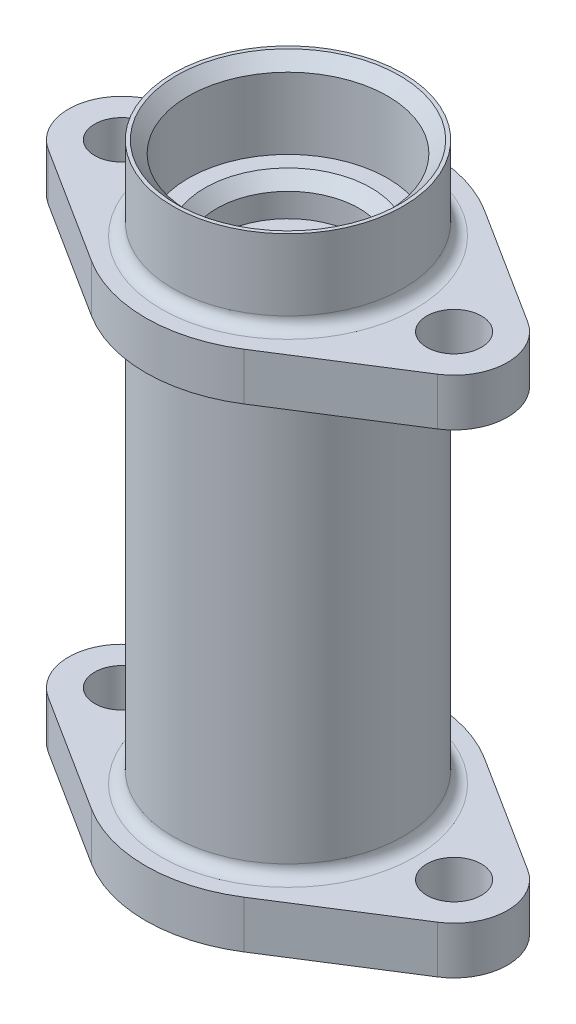
ISO-10303-21;
HEADER;
FILE_DESCRIPTION(('STEP AP214'),'2;1');
FILE_NAME('part.step','',(''),(''),'','','');
FILE_SCHEMA(('AUTOMOTIVE_DESIGN { 1 0 10303 214 1 1 1 1 }'));
ENDSEC;
DATA;
#1=APPLICATION_CONTEXT('core data for automotive mechanical design processes');
#2=APPLICATION_PROTOCOL_DEFINITION('international standard','automotive_design',2000,#1);
#3=PRODUCT_CONTEXT('',#1,'mechanical');
#4=PRODUCT('Part','Part','',(#3));
#5=PRODUCT_RELATED_PRODUCT_CATEGORY('part','',(#4));
#6=PRODUCT_DEFINITION_FORMATION('','',#4);
#7=PRODUCT_DEFINITION_CONTEXT('part definition',#1,'design');
#8=PRODUCT_DEFINITION('design','',#6,#7);
#9=PRODUCT_DEFINITION_SHAPE('','',#8);
#10=(LENGTH_UNIT() NAMED_UNIT(*) SI_UNIT(.MILLI.,.METRE.));
#11=(NAMED_UNIT(*) PLANE_ANGLE_UNIT() SI_UNIT($,.RADIAN.));
#12=(NAMED_UNIT(*) SI_UNIT($,.STERADIAN.) SOLID_ANGLE_UNIT());
#13=UNCERTAINTY_MEASURE_WITH_UNIT(LENGTH_MEASURE(1.E-05),#10,'distance_accuracy_value','');
#14=(GEOMETRIC_REPRESENTATION_CONTEXT(3) GLOBAL_UNCERTAINTY_ASSIGNED_CONTEXT((#13)) GLOBAL_UNIT_ASSIGNED_CONTEXT((#10,
#11,#12)) REPRESENTATION_CONTEXT('',''));
#15=CARTESIAN_POINT('',(0.,0.,0.));
#16=DIRECTION('',(0.,0.,1.));
#17=DIRECTION('',(1.,0.,0.));
#18=AXIS2_PLACEMENT_3D('',#15,#16,#17);
#19=CARTESIAN_POINT('',(0.,22.0000000000482,0.));
#20=DIRECTION('',(0.,1.,0.));
#21=DIRECTION('',(0.,0.,1.));
#22=AXIS2_PLACEMENT_3D('',#19,#20,#21);
#23=CONICAL_SURFACE('',#22,3.49999999997408,0.785398163454292);
#24=CARTESIAN_POINT('',(0.,22.0000000000482,0.));
#25=DIRECTION('',(0.,1.,0.));
#26=DIRECTION('',(0.,0.,1.));
#27=AXIS2_PLACEMENT_3D('',#24,#25,#26);
#28=CIRCLE('',#27,3.49999999997408);
#29=CARTESIAN_POINT('',(0.,22.0000000000482,3.49999999997408));
#30=VERTEX_POINT('',#29);
#31=EDGE_CURVE('E211',#30,#30,#28,.F.);
#32=ORIENTED_EDGE('',*,*,#31,.F.);
#33=EDGE_LOOP('',(#32));
#34=FACE_BOUND('',#33,.T.);
#35=CARTESIAN_POINT('',(0.,21.5,0.));
#36=DIRECTION('',(0.,1.,0.));
#37=DIRECTION('',(0.,0.,1.));
#38=AXIS2_PLACEMENT_3D('',#35,#36,#37);
#39=CIRCLE('',#38,3.00000000000002);
#40=CARTESIAN_POINT('',(0.,21.5,3.00000000000002));
#41=VERTEX_POINT('',#40);
#42=EDGE_CURVE('E210',#41,#41,#39,.F.);
#43=ORIENTED_EDGE('',*,*,#42,.T.);
#44=EDGE_LOOP('',(#43));
#45=FACE_BOUND('',#44,.T.);
#46=ADVANCED_FACE('F17',(#34,#45),#23,.F.);
#47=CARTESIAN_POINT('',(0.,22.,0.));
#48=DIRECTION('',(0.,1.,0.));
#49=DIRECTION('',(0.,0.,1.));
#50=AXIS2_PLACEMENT_3D('',#47,#48,#49);
#51=PLANE('',#50);
#52=CARTESIAN_POINT('',(0.,22.,0.));
#53=DIRECTION('',(0.,1.,0.));
#54=DIRECTION('',(0.,0.,1.));
#55=AXIS2_PLACEMENT_3D('',#52,#53,#54);
#56=CIRCLE('',#55,4.20000000000003);
#57=CARTESIAN_POINT('',(0.,22.,4.20000000000003));
#58=VERTEX_POINT('',#57);
#59=EDGE_CURVE('E207',#58,#58,#56,.T.);
#60=ORIENTED_EDGE('',*,*,#59,.T.);
#61=EDGE_LOOP('',(#60));
#62=FACE_BOUND('',#61,.T.);
#63=ORIENTED_EDGE('',*,*,#31,.T.);
#64=EDGE_LOOP('',(#63));
#65=FACE_BOUND('',#64,.T.);
#66=ADVANCED_FACE('F877',(#62,#65),#51,.T.);
#67=CARTESIAN_POINT('',(0.,20.5,0.));
#68=DIRECTION('',(0.,1.,0.));
#69=DIRECTION('',(0.,0.,1.));
#70=AXIS2_PLACEMENT_3D('',#67,#68,#69);
#71=CYLINDRICAL_SURFACE('',#70,3.00000000000002);
#72=ORIENTED_EDGE('',*,*,#42,.F.);
#73=EDGE_LOOP('',(#72));
#74=FACE_BOUND('',#73,.T.);
#75=CARTESIAN_POINT('',(0.,20.5,0.));
#76=DIRECTION('',(0.,1.,0.));
#77=DIRECTION('',(0.,0.,1.));
#78=AXIS2_PLACEMENT_3D('',#75,#76,#77);
#79=CIRCLE('',#78,3.00000000000002);
#80=CARTESIAN_POINT('',(0.,20.5,3.00000000000002));
#81=VERTEX_POINT('',#80);
#82=EDGE_CURVE('E204',#81,#81,#79,.T.);
#83=ORIENTED_EDGE('',*,*,#82,.F.);
#84=EDGE_LOOP('',(#83));
#85=FACE_BOUND('',#84,.T.);
#86=ADVANCED_FACE('F868',(#74,#85),#71,.F.);
#87=CARTESIAN_POINT('',(0.,22.,0.));
#88=DIRECTION('',(0.,1.,0.));
#89=DIRECTION('',(0.,0.,1.));
#90=AXIS2_PLACEMENT_3D('',#87,#88,#89);
#91=CYLINDRICAL_SURFACE('',#90,4.20000000000003);
#92=ORIENTED_EDGE('',*,*,#59,.F.);
#93=EDGE_LOOP('',(#92));
#94=FACE_BOUND('',#93,.T.);
#95=CARTESIAN_POINT('',(0.,24.9999999999773,0.));
#96=DIRECTION('',(0.,1.,0.));
#97=DIRECTION('',(0.,0.,1.));
#98=AXIS2_PLACEMENT_3D('',#95,#96,#97);
#99=CIRCLE('',#98,4.20000000002574);
#100=CARTESIAN_POINT('',(0.,24.9999999999773,4.20000000002574));
#101=VERTEX_POINT('',#100);
#102=EDGE_CURVE('E203',#101,#101,#99,.T.);
#103=ORIENTED_EDGE('',*,*,#102,.T.);
#104=EDGE_LOOP('',(#103));
#105=FACE_BOUND('',#104,.T.);
#106=ADVANCED_FACE('F859',(#94,#105),#91,.F.);
#107=CARTESIAN_POINT('',(0.,20.5,0.));
#108=DIRECTION('',(0.,1.,0.));
#109=DIRECTION('',(0.,0.,1.));
#110=AXIS2_PLACEMENT_3D('',#107,#108,#109);
#111=PLANE('',#110);
#112=ORIENTED_EDGE('',*,*,#82,.T.);
#113=EDGE_LOOP('',(#112));
#114=FACE_BOUND('',#113,.T.);
#115=CARTESIAN_POINT('',(0.,20.5,0.));
#116=DIRECTION('',(0.,1.,0.));
#117=DIRECTION('',(0.,0.,1.));
#118=AXIS2_PLACEMENT_3D('',#115,#116,#117);
#119=CIRCLE('',#118,1.00000000000001);
#120=CARTESIAN_POINT('',(0.,20.5,1.00000000000001));
#121=VERTEX_POINT('',#120);
#122=EDGE_CURVE('E200',#121,#121,#119,.F.);
#123=ORIENTED_EDGE('',*,*,#122,.T.);
#124=EDGE_LOOP('',(#123));
#125=FACE_BOUND('',#124,.T.);
#126=ADVANCED_FACE('F850',(#114,#125),#111,.T.);
#127=CARTESIAN_POINT('',(0.,25.4999999999654,0.));
#128=DIRECTION('',(0.,1.,0.));
#129=DIRECTION('',(-1.,0.,0.));
#130=AXIS2_PLACEMENT_3D('',#127,#128,#129);
#131=CONICAL_SURFACE('',#130,4.70000000001392,0.785398163397448);
#132=ORIENTED_EDGE('',*,*,#102,.F.);
#133=EDGE_LOOP('',(#132));
#134=FACE_BOUND('',#133,.T.);
#135=CARTESIAN_POINT('',(0.,25.4999999999654,0.));
#136=DIRECTION('',(0.,1.,0.));
#137=DIRECTION('',(-1.,0.,0.));
#138=AXIS2_PLACEMENT_3D('',#135,#136,#137);
#139=CIRCLE('',#138,4.70000000001392);
#140=CARTESIAN_POINT('',(-4.70000000001392,25.4999999999654,0.));
#141=VERTEX_POINT('',#140);
#142=EDGE_CURVE('E197',#141,#141,#139,.F.);
#143=ORIENTED_EDGE('',*,*,#142,.F.);
#144=EDGE_LOOP('',(#143));
#145=FACE_BOUND('',#144,.T.);
#146=ADVANCED_FACE('F841',(#134,#145),#131,.F.);
#147=CARTESIAN_POINT('',(0.,0.,0.));
#148=DIRECTION('',(0.,1.,0.));
#149=DIRECTION('',(0.,0.,1.));
#150=AXIS2_PLACEMENT_3D('',#147,#148,#149);
#151=CYLINDRICAL_SURFACE('',#150,1.00000000000001);
#152=ORIENTED_EDGE('',*,*,#122,.F.);
#153=EDGE_LOOP('',(#152));
#154=FACE_BOUND('',#153,.T.);
#155=CARTESIAN_POINT('',(0.,19.,0.));
#156=DIRECTION('',(0.,1.,0.));
#157=DIRECTION('',(0.,0.,1.));
#158=AXIS2_PLACEMENT_3D('',#155,#156,#157);
#159=CIRCLE('',#158,1.00000000000001);
#160=CARTESIAN_POINT('',(0.,19.,1.00000000000001));
#161=VERTEX_POINT('',#160);
#162=EDGE_CURVE('E194',#161,#161,#159,.T.);
#163=ORIENTED_EDGE('',*,*,#162,.F.);
#164=EDGE_LOOP('',(#163));
#165=FACE_BOUND('',#164,.T.);
#166=ADVANCED_FACE('F832',(#154,#165),#151,.F.);
#167=CARTESIAN_POINT('',(0.,25.5,0.));
#168=DIRECTION('',(0.,1.,0.));
#169=DIRECTION('',(0.,0.,1.));
#170=AXIS2_PLACEMENT_3D('',#167,#168,#169);
#171=PLANE('',#170);
#172=CARTESIAN_POINT('',(0.,25.5,0.));
#173=DIRECTION('',(0.,-1.,0.));
#174=DIRECTION('',(0.,0.,-1.));
#175=AXIS2_PLACEMENT_3D('',#172,#173,#174);
#176=CIRCLE('',#175,4.85000000000003);
#177=CARTESIAN_POINT('',(0.,25.5,-4.85000000000003));
#178=VERTEX_POINT('',#177);
#179=EDGE_CURVE('E191',#178,#178,#176,.T.);
#180=ORIENTED_EDGE('',*,*,#179,.F.);
#181=EDGE_LOOP('',(#180));
#182=FACE_BOUND('',#181,.T.);
#183=ORIENTED_EDGE('',*,*,#142,.T.);
#184=EDGE_LOOP('',(#183));
#185=FACE_BOUND('',#184,.T.);
#186=ADVANCED_FACE('F823',(#182,#185),#171,.T.);
#187=CARTESIAN_POINT('',(0.,19.,0.));
#188=DIRECTION('',(0.,-1.,0.));
#189=DIRECTION('',(0.,0.,-1.));
#190=AXIS2_PLACEMENT_3D('',#187,#188,#189);
#191=PLANE('',#190);
#192=ORIENTED_EDGE('',*,*,#162,.T.);
#193=EDGE_LOOP('',(#192));
#194=FACE_BOUND('',#193,.T.);
#195=CARTESIAN_POINT('',(0.,19.,0.));
#196=DIRECTION('',(0.,-1.,0.));
#197=DIRECTION('',(0.,0.,-1.));
#198=AXIS2_PLACEMENT_3D('',#195,#196,#197);
#199=CIRCLE('',#198,4.20000000000003);
#200=CARTESIAN_POINT('',(0.,19.,-4.20000000000003));
#201=VERTEX_POINT('',#200);
#202=EDGE_CURVE('E187',#201,#201,#199,.T.);
#203=ORIENTED_EDGE('',*,*,#202,.T.);
#204=EDGE_LOOP('',(#203));
#205=FACE_BOUND('',#204,.T.);
#206=ADVANCED_FACE('F814',(#194,#205),#191,.T.);
#207=CARTESIAN_POINT('',(0.,25.5,0.));
#208=DIRECTION('',(0.,-1.,0.));
#209=DIRECTION('',(0.,0.,-1.));
#210=AXIS2_PLACEMENT_3D('',#207,#208,#209);
#211=CYLINDRICAL_SURFACE('',#210,4.85000000000003);
#212=CARTESIAN_POINT('',(0.,22.5,0.));
#213=DIRECTION('',(0.,1.,0.));
#214=DIRECTION('',(0.,0.,1.));
#215=AXIS2_PLACEMENT_3D('',#212,#213,#214);
#216=CIRCLE('',#215,4.85);
#217=CARTESIAN_POINT('',(0.,22.5,4.85));
#218=VERTEX_POINT('',#217);
#219=EDGE_CURVE('E190',#218,#218,#216,.T.);
#220=ORIENTED_EDGE('',*,*,#219,.T.);
#221=EDGE_LOOP('',(#220));
#222=FACE_BOUND('',#221,.T.);
#223=ORIENTED_EDGE('',*,*,#179,.T.);
#224=EDGE_LOOP('',(#223));
#225=FACE_BOUND('',#224,.T.);
#226=ADVANCED_FACE('F806',(#222,#225),#211,.T.);
#227=CARTESIAN_POINT('',(0.,19.,0.));
#228=DIRECTION('',(0.,-1.,0.));
#229=DIRECTION('',(0.,0.,-1.));
#230=AXIS2_PLACEMENT_3D('',#227,#228,#229);
#231=CYLINDRICAL_SURFACE('',#230,4.20000000000003);
#232=ORIENTED_EDGE('',*,*,#202,.F.);
#233=EDGE_LOOP('',(#232));
#234=FACE_BOUND('',#233,.T.);
#235=CARTESIAN_POINT('',(0.,0.5,0.));
#236=DIRECTION('',(0.,1.,0.));
#237=DIRECTION('',(0.,0.,1.));
#238=AXIS2_PLACEMENT_3D('',#235,#236,#237);
#239=CIRCLE('',#238,4.2);
#240=CARTESIAN_POINT('',(0.,0.5,4.2));
#241=VERTEX_POINT('',#240);
#242=EDGE_CURVE('E492',#241,#241,#239,.T.);
#243=ORIENTED_EDGE('',*,*,#242,.F.);
#244=EDGE_LOOP('',(#243));
#245=FACE_BOUND('',#244,.T.);
#246=ADVANCED_FACE('F798',(#234,#245),#231,.F.);
#247=CARTESIAN_POINT('',(0.,22.5,0.));
#248=DIRECTION('',(0.,1.,0.));
#249=DIRECTION('',(0.,0.,1.));
#250=AXIS2_PLACEMENT_3D('',#247,#248,#249);
#251=TOROIDAL_SURFACE('',#250,5.35,0.5);
#252=ORIENTED_EDGE('',*,*,#219,.F.);
#253=EDGE_LOOP('',(#252));
#254=FACE_BOUND('',#253,.T.);
#255=CARTESIAN_POINT('',(0.,22.,0.));
#256=DIRECTION('',(0.,1.,0.));
#257=DIRECTION('',(0.,0.,-1.));
#258=AXIS2_PLACEMENT_3D('',#255,#256,#257);
#259=CIRCLE('',#258,5.35000000000002);
#260=CARTESIAN_POINT('',(0.,22.,5.35000000000002));
#261=VERTEX_POINT('',#260);
#262=CARTESIAN_POINT('',(0.,22.,-5.35000000000002));
#263=VERTEX_POINT('',#262);
#264=EDGE_CURVE('E445',#261,#263,#259,.F.);
#265=ORIENTED_EDGE('',*,*,#264,.F.);
#266=CARTESIAN_POINT('',(0.,22.,0.));
#267=DIRECTION('',(0.,1.,0.));
#268=DIRECTION('',(0.,0.,1.));
#269=AXIS2_PLACEMENT_3D('',#266,#267,#268);
#270=CIRCLE('',#269,5.35000000000002);
#271=EDGE_CURVE('E455',#263,#261,#270,.F.);
#272=ORIENTED_EDGE('',*,*,#271,.F.);
#273=EDGE_LOOP('',(#265,#272));
#274=FACE_BOUND('',#273,.T.);
#275=ADVANCED_FACE('F473',(#254,#274),#251,.F.);
#276=CARTESIAN_POINT('',(0.,0.5,0.));
#277=DIRECTION('',(0.,1.,0.));
#278=DIRECTION('',(0.,0.,1.));
#279=AXIS2_PLACEMENT_3D('',#276,#277,#278);
#280=TOROIDAL_SURFACE('',#279,4.7,0.5);
#281=CARTESIAN_POINT('',(0.,0.,0.));
#282=DIRECTION('',(0.,-1.,0.));
#283=DIRECTION('',(0.,0.,1.));
#284=AXIS2_PLACEMENT_3D('',#281,#282,#283);
#285=CIRCLE('',#284,4.70000000000002);
#286=CARTESIAN_POINT('',(0.,0.,4.70000000000002));
#287=VERTEX_POINT('',#286);
#288=CARTESIAN_POINT('',(0.,0.,-4.70000000000002));
#289=VERTEX_POINT('',#288);
#290=EDGE_CURVE('E402',#287,#289,#285,.T.);
#291=ORIENTED_EDGE('',*,*,#290,.T.);
#292=CARTESIAN_POINT('',(0.,0.,0.));
#293=DIRECTION('',(0.,-1.,0.));
#294=DIRECTION('',(0.,0.,-1.));
#295=AXIS2_PLACEMENT_3D('',#292,#293,#294);
#296=CIRCLE('',#295,4.70000000000002);
#297=EDGE_CURVE('E186',#289,#287,#296,.T.);
#298=ORIENTED_EDGE('',*,*,#297,.T.);
#299=EDGE_LOOP('',(#291,#298));
#300=FACE_BOUND('',#299,.T.);
#301=ORIENTED_EDGE('',*,*,#242,.T.);
#302=EDGE_LOOP('',(#301));
#303=FACE_BOUND('',#302,.T.);
#304=ADVANCED_FACE('F470',(#300,#303),#280,.T.);
#305=CARTESIAN_POINT('',(0.,22.,0.));
#306=DIRECTION('',(0.,1.,0.));
#307=DIRECTION('',(0.,0.,1.));
#308=AXIS2_PLACEMENT_3D('',#305,#306,#307);
#309=PLANE('',#308);
#310=CARTESIAN_POINT('',(7.00000000000001,22.,0.));
#311=DIRECTION('',(0.,-1.,0.));
#312=DIRECTION('',(0.,0.,-1.));
#313=AXIS2_PLACEMENT_3D('',#310,#311,#312);
#314=CIRCLE('',#313,1.15000000000001);
#315=CARTESIAN_POINT('',(7.00000000000001,22.,-1.15000000000001));
#316=VERTEX_POINT('',#315);
#317=EDGE_CURVE('E378',#316,#316,#314,.T.);
#318=ORIENTED_EDGE('',*,*,#317,.T.);
#319=EDGE_LOOP('',(#318));
#320=FACE_BOUND('',#319,.T.);
#321=CARTESIAN_POINT('',(-7.00000000000006,22.,0.));
#322=DIRECTION('',(0.,-1.,0.));
#323=DIRECTION('',(0.,0.,-1.));
#324=AXIS2_PLACEMENT_3D('',#321,#322,#323);
#325=CIRCLE('',#324,2.25000000000002);
#326=CARTESIAN_POINT('',(-8.20535714285719,22.,1.89989845996129));
#327=VERTEX_POINT('',#326);
#328=CARTESIAN_POINT('',(-8.20535714285718,22.,-1.89989845996129));
#329=VERTEX_POINT('',#328);
#330=EDGE_CURVE('E388',#327,#329,#325,.T.);
#331=ORIENTED_EDGE('',*,*,#330,.F.);
#332=DIRECTION('',(-0.844399315538349,0.,-0.535714285714286));
#333=VECTOR('',#332,1.);
#334=CARTESIAN_POINT('',(-8.20535714285717,22.,1.8998984599613));
#335=LINE('',#334,#333);
#336=CARTESIAN_POINT('',(-3.21428571428573,22.,5.06639589323013));
#337=VERTEX_POINT('',#336);
#338=EDGE_CURVE('E381',#327,#337,#335,.F.);
#339=ORIENTED_EDGE('',*,*,#338,.T.);
#340=CARTESIAN_POINT('',(0.,22.,0.));
#341=DIRECTION('',(0.,-1.,0.));
#342=DIRECTION('',(0.,0.,-1.));
#343=AXIS2_PLACEMENT_3D('',#340,#341,#342);
#344=CIRCLE('',#343,6.00000000000004);
#345=CARTESIAN_POINT('',(3.21428571428573,22.,5.06639589323012));
#346=VERTEX_POINT('',#345);
#347=EDGE_CURVE('E162',#346,#337,#344,.T.);
#348=ORIENTED_EDGE('',*,*,#347,.F.);
#349=DIRECTION('',(-0.844399315538349,0.,0.535714285714286));
#350=VECTOR('',#349,1.);
#351=CARTESIAN_POINT('',(3.21428571428573,22.,5.0663958932301));
#352=LINE('',#351,#350);
#353=CARTESIAN_POINT('',(8.20535714285715,22.,1.8998984599613));
#354=VERTEX_POINT('',#353);
#355=EDGE_CURVE('E157',#346,#354,#352,.F.);
#356=ORIENTED_EDGE('',*,*,#355,.T.);
#357=CARTESIAN_POINT('',(7.00000000000001,22.,0.));
#358=DIRECTION('',(0.,-1.,0.));
#359=DIRECTION('',(0.,0.,-1.));
#360=AXIS2_PLACEMENT_3D('',#357,#358,#359);
#361=CIRCLE('',#360,2.25000000000002);
#362=CARTESIAN_POINT('',(8.20535714285717,22.,-1.89989845996133));
#363=VERTEX_POINT('',#362);
#364=EDGE_CURVE('E154',#363,#354,#361,.T.);
#365=ORIENTED_EDGE('',*,*,#364,.F.);
#366=DIRECTION('',(0.844399315538349,0.,0.535714285714286));
#367=VECTOR('',#366,1.);
#368=CARTESIAN_POINT('',(8.20535714285716,22.,-1.89989845996133));
#369=LINE('',#368,#367);
#370=CARTESIAN_POINT('',(3.21428571428573,22.,-5.06639589323014));
#371=VERTEX_POINT('',#370);
#372=EDGE_CURVE('E396',#363,#371,#369,.F.);
#373=ORIENTED_EDGE('',*,*,#372,.T.);
#374=CARTESIAN_POINT('',(0.,22.,0.));
#375=DIRECTION('',(0.,-1.,0.));
#376=DIRECTION('',(0.,0.,-1.));
#377=AXIS2_PLACEMENT_3D('',#374,#375,#376);
#378=CIRCLE('',#377,6.00000000000004);
#379=CARTESIAN_POINT('',(-3.21428571428572,22.,-5.0663958932301));
#380=VERTEX_POINT('',#379);
#381=EDGE_CURVE('E182',#380,#371,#378,.T.);
#382=ORIENTED_EDGE('',*,*,#381,.F.);
#383=DIRECTION('',(0.844399315538349,0.,-0.535714285714286));
#384=VECTOR('',#383,1.);
#385=CARTESIAN_POINT('',(-3.21428571428573,22.,-5.0663958932301));
#386=LINE('',#385,#384);
#387=EDGE_CURVE('E392',#380,#329,#386,.F.);
#388=ORIENTED_EDGE('',*,*,#387,.T.);
#389=EDGE_LOOP('',(#331,#339,#348,#356,#365,#373,#382,#388));
#390=FACE_BOUND('',#389,.T.);
#391=CARTESIAN_POINT('',(-7.00000000000006,22.,0.));
#392=DIRECTION('',(0.,-1.,0.));
#393=DIRECTION('',(0.,0.,-1.));
#394=AXIS2_PLACEMENT_3D('',#391,#392,#393);
#395=CIRCLE('',#394,1.15000000000001);
#396=CARTESIAN_POINT('',(-7.00000000000006,22.,-1.15000000000001));
#397=VERTEX_POINT('',#396);
#398=EDGE_CURVE('E165',#397,#397,#395,.T.);
#399=ORIENTED_EDGE('',*,*,#398,.T.);
#400=EDGE_LOOP('',(#399));
#401=FACE_BOUND('',#400,.T.);
#402=ORIENTED_EDGE('',*,*,#264,.T.);
#403=ORIENTED_EDGE('',*,*,#271,.T.);
#404=EDGE_LOOP('',(#402,#403));
#405=FACE_BOUND('',#404,.T.);
#406=ADVANCED_FACE('F159',(#320,#390,#401,#405),#309,.T.);
#407=CARTESIAN_POINT('',(0.,0.,0.));
#408=DIRECTION('',(0.,1.,0.));
#409=DIRECTION('',(0.,0.,1.));
#410=AXIS2_PLACEMENT_3D('',#407,#408,#409);
#411=PLANE('',#410);
#412=CARTESIAN_POINT('',(7.00000000000001,0.,0.));
#413=DIRECTION('',(0.,-1.,0.));
#414=DIRECTION('',(0.,0.,-1.));
#415=AXIS2_PLACEMENT_3D('',#412,#413,#414);
#416=CIRCLE('',#415,1.15000000000001);
#417=CARTESIAN_POINT('',(7.00000000000001,0.,-1.15000000000001));
#418=VERTEX_POINT('',#417);
#419=EDGE_CURVE('E527',#418,#418,#416,.F.);
#420=ORIENTED_EDGE('',*,*,#419,.T.);
#421=EDGE_LOOP('',(#420));
#422=FACE_BOUND('',#421,.T.);
#423=CARTESIAN_POINT('',(-7.00000000000006,0.,0.));
#424=DIRECTION('',(0.,-1.,0.));
#425=DIRECTION('',(0.,0.,-1.));
#426=AXIS2_PLACEMENT_3D('',#423,#424,#425);
#427=CIRCLE('',#426,1.15000000000001);
#428=CARTESIAN_POINT('',(-7.00000000000006,0.,-1.15000000000001));
#429=VERTEX_POINT('',#428);
#430=EDGE_CURVE('E350',#429,#429,#427,.F.);
#431=ORIENTED_EDGE('',*,*,#430,.T.);
#432=EDGE_LOOP('',(#431));
#433=FACE_BOUND('',#432,.T.);
#434=DIRECTION('',(0.844399315538349,0.,0.535714285714286));
#435=VECTOR('',#434,1.);
#436=CARTESIAN_POINT('',(-3.21428571428571,0.,5.0663958932301));
#437=LINE('',#436,#435);
#438=CARTESIAN_POINT('',(-8.20535714285718,0.,1.89989845996129));
#439=VERTEX_POINT('',#438);
#440=CARTESIAN_POINT('',(-3.21428571428573,0.,5.06639589323012));
#441=VERTEX_POINT('',#440);
#442=EDGE_CURVE('E427',#439,#441,#437,.T.);
#443=ORIENTED_EDGE('',*,*,#442,.F.);
#444=CARTESIAN_POINT('',(-7.00000000000006,0.,0.));
#445=DIRECTION('',(0.,-1.,0.));
#446=DIRECTION('',(0.,0.,-1.));
#447=AXIS2_PLACEMENT_3D('',#444,#445,#446);
#448=CIRCLE('',#447,2.25000000000002);
#449=CARTESIAN_POINT('',(-8.20535714285718,0.,-1.89989845996129));
#450=VERTEX_POINT('',#449);
#451=EDGE_CURVE('E374',#450,#439,#448,.F.);
#452=ORIENTED_EDGE('',*,*,#451,.F.);
#453=DIRECTION('',(-0.844399315538349,0.,0.535714285714286));
#454=VECTOR('',#453,1.);
#455=CARTESIAN_POINT('',(-8.20535714285717,0.,-1.8998984599613));
#456=LINE('',#455,#454);
#457=CARTESIAN_POINT('',(-3.21428571428574,0.,-5.06639589323012));
#458=VERTEX_POINT('',#457);
#459=EDGE_CURVE('E370',#458,#450,#456,.T.);
#460=ORIENTED_EDGE('',*,*,#459,.F.);
#461=CARTESIAN_POINT('',(0.,0.,0.));
#462=DIRECTION('',(0.,-1.,0.));
#463=DIRECTION('',(0.,0.,-1.));
#464=AXIS2_PLACEMENT_3D('',#461,#462,#463);
#465=CIRCLE('',#464,6.00000000000004);
#466=CARTESIAN_POINT('',(3.21428571428574,0.,-5.06639589323014));
#467=VERTEX_POINT('',#466);
#468=EDGE_CURVE('E366',#467,#458,#465,.F.);
#469=ORIENTED_EDGE('',*,*,#468,.F.);
#470=DIRECTION('',(-0.844399315538349,0.,-0.535714285714286));
#471=VECTOR('',#470,1.);
#472=CARTESIAN_POINT('',(8.20535714285716,0.,-1.89989845996133));
#473=LINE('',#472,#471);
#474=CARTESIAN_POINT('',(8.20535714285716,0.,-1.89989845996131));
#475=VERTEX_POINT('',#474);
#476=EDGE_CURVE('E362',#475,#467,#473,.T.);
#477=ORIENTED_EDGE('',*,*,#476,.F.);
#478=CARTESIAN_POINT('',(7.00000000000001,0.,0.));
#479=DIRECTION('',(0.,-1.,0.));
#480=DIRECTION('',(0.,0.,-1.));
#481=AXIS2_PLACEMENT_3D('',#478,#479,#480);
#482=CIRCLE('',#481,2.25000000000002);
#483=CARTESIAN_POINT('',(8.20535714285714,0.,1.8998984599613));
#484=VERTEX_POINT('',#483);
#485=EDGE_CURVE('E358',#484,#475,#482,.F.);
#486=ORIENTED_EDGE('',*,*,#485,.F.);
#487=DIRECTION('',(0.844399315538349,0.,-0.535714285714286));
#488=VECTOR('',#487,1.);
#489=CARTESIAN_POINT('',(8.20535714285713,0.,1.8998984599613));
#490=LINE('',#489,#488);
#491=CARTESIAN_POINT('',(3.21428571428573,0.,5.06639589323011));
#492=VERTEX_POINT('',#491);
#493=EDGE_CURVE('E354',#492,#484,#490,.T.);
#494=ORIENTED_EDGE('',*,*,#493,.F.);
#495=CARTESIAN_POINT('',(0.,0.,0.));
#496=DIRECTION('',(0.,-1.,0.));
#497=DIRECTION('',(0.,0.,-1.));
#498=AXIS2_PLACEMENT_3D('',#495,#496,#497);
#499=CIRCLE('',#498,6.00000000000004);
#500=EDGE_CURVE('E347',#441,#492,#499,.F.);
#501=ORIENTED_EDGE('',*,*,#500,.F.);
#502=EDGE_LOOP('',(#443,#452,#460,#469,#477,#486,#494,#501));
#503=FACE_BOUND('',#502,.T.);
#504=ORIENTED_EDGE('',*,*,#290,.F.);
#505=ORIENTED_EDGE('',*,*,#297,.F.);
#506=EDGE_LOOP('',(#504,#505));
#507=FACE_BOUND('',#506,.T.);
#508=ADVANCED_FACE('F408',(#422,#433,#503,#507),#411,.F.);
#509=CARTESIAN_POINT('',(-7.00000000000006,22.,0.));
#510=DIRECTION('',(0.,-1.,0.));
#511=DIRECTION('',(0.,0.,-1.));
#512=AXIS2_PLACEMENT_3D('',#509,#510,#511);
#513=CYLINDRICAL_SURFACE('',#512,1.15000000000001);
#514=CARTESIAN_POINT('',(-7.00000000000006,20.,0.));
#515=DIRECTION('',(0.,-1.,0.));
#516=DIRECTION('',(0.,0.,-1.));
#517=AXIS2_PLACEMENT_3D('',#514,#515,#516);
#518=CIRCLE('',#517,1.15000000000001);
#519=CARTESIAN_POINT('',(-7.00000000000006,20.,-1.15000000000001));
#520=VERTEX_POINT('',#519);
#521=EDGE_CURVE('E328',#520,#520,#518,.T.);
#522=ORIENTED_EDGE('',*,*,#521,.T.);
#523=EDGE_LOOP('',(#522));
#524=FACE_BOUND('',#523,.T.);
#525=ORIENTED_EDGE('',*,*,#398,.F.);
#526=EDGE_LOOP('',(#525));
#527=FACE_BOUND('',#526,.T.);
#528=ADVANCED_FACE('F418',(#524,#527),#513,.F.);
#529=CARTESIAN_POINT('',(3.21428571428573,22.,5.0663958932301));
#530=DIRECTION('',(-0.535714285714286,0.,-0.844399315538349));
#531=DIRECTION('',(-0.844399315538349,0.,0.535714285714286));
#532=AXIS2_PLACEMENT_3D('',#529,#530,#531);
#533=PLANE('',#532);
#534=DIRECTION('',(0.,-1.,0.));
#535=VECTOR('',#534,1.);
#536=CARTESIAN_POINT('',(8.20535714285714,22.,1.89989845996131));
#537=LINE('',#536,#535);
#538=CARTESIAN_POINT('',(8.20535714285715,20.,1.8998984599613));
#539=VERTEX_POINT('',#538);
#540=EDGE_CURVE('E168',#354,#539,#537,.T.);
#541=ORIENTED_EDGE('',*,*,#540,.F.);
#542=ORIENTED_EDGE('',*,*,#355,.F.);
#543=DIRECTION('',(0.,-1.,0.));
#544=VECTOR('',#543,1.);
#545=CARTESIAN_POINT('',(3.21428571428575,22.,5.06639589323013));
#546=LINE('',#545,#544);
#547=CARTESIAN_POINT('',(3.21428571428574,20.,5.06639589323011));
#548=VERTEX_POINT('',#547);
#549=EDGE_CURVE('E379',#548,#346,#546,.F.);
#550=ORIENTED_EDGE('',*,*,#549,.F.);
#551=DIRECTION('',(0.844399315538348,0.,-0.535714285714287));
#552=VECTOR('',#551,1.);
#553=CARTESIAN_POINT('',(3.21428571428573,20.,5.0663958932301));
#554=LINE('',#553,#552);
#555=EDGE_CURVE('E171',#548,#539,#554,.T.);
#556=ORIENTED_EDGE('',*,*,#555,.T.);
#557=EDGE_LOOP('',(#541,#542,#550,#556));
#558=FACE_BOUND('',#557,.T.);
#559=ADVANCED_FACE('F169',(#558),#533,.F.);
#560=CARTESIAN_POINT('',(7.00000000000001,22.,0.));
#561=DIRECTION('',(0.,-1.,0.));
#562=DIRECTION('',(0.,0.,-1.));
#563=AXIS2_PLACEMENT_3D('',#560,#561,#562);
#564=CYLINDRICAL_SURFACE('',#563,2.25000000000002);
#565=ORIENTED_EDGE('',*,*,#364,.T.);
#566=ORIENTED_EDGE('',*,*,#540,.T.);
#567=CARTESIAN_POINT('',(7.00000000000001,20.,0.));
#568=DIRECTION('',(0.,-1.,0.));
#569=DIRECTION('',(0.,0.,-1.));
#570=AXIS2_PLACEMENT_3D('',#567,#568,#569);
#571=CIRCLE('',#570,2.25000000000002);
#572=CARTESIAN_POINT('',(8.20535714285716,20.,-1.89989845996133));
#573=VERTEX_POINT('',#572);
#574=EDGE_CURVE('E326',#539,#573,#571,.F.);
#575=ORIENTED_EDGE('',*,*,#574,.T.);
#576=DIRECTION('',(0.,1.,0.));
#577=VECTOR('',#576,1.);
#578=CARTESIAN_POINT('',(8.20535714285716,22.,-1.89989845996133));
#579=LINE('',#578,#577);
#580=EDGE_CURVE('E174',#573,#363,#579,.T.);
#581=ORIENTED_EDGE('',*,*,#580,.T.);
#582=EDGE_LOOP('',(#565,#566,#575,#581));
#583=FACE_BOUND('',#582,.T.);
#584=ADVANCED_FACE('F176',(#583),#564,.T.);
#585=CARTESIAN_POINT('',(8.20535714285716,22.,-1.89989845996133));
#586=DIRECTION('',(-0.535714285714286,0.,0.844399315538349));
#587=DIRECTION('',(0.844399315538349,0.,0.535714285714286));
#588=AXIS2_PLACEMENT_3D('',#585,#586,#587);
#589=PLANE('',#588);
#590=DIRECTION('',(0.,-1.,0.));
#591=VECTOR('',#590,1.);
#592=CARTESIAN_POINT('',(3.21428571428573,22.,-5.06639589323014));
#593=LINE('',#592,#591);
#594=CARTESIAN_POINT('',(3.2142857142857,20.,-5.06639589323013));
#595=VERTEX_POINT('',#594);
#596=EDGE_CURVE('E393',#371,#595,#593,.T.);
#597=ORIENTED_EDGE('',*,*,#596,.F.);
#598=ORIENTED_EDGE('',*,*,#372,.F.);
#599=ORIENTED_EDGE('',*,*,#580,.F.);
#600=DIRECTION('',(-0.844399315538353,0.,-0.535714285714279));
#601=VECTOR('',#600,1.);
#602=CARTESIAN_POINT('',(8.20535714285716,20.,-1.89989845996133));
#603=LINE('',#602,#601);
#604=EDGE_CURVE('E323',#573,#595,#603,.T.);
#605=ORIENTED_EDGE('',*,*,#604,.T.);
#606=EDGE_LOOP('',(#597,#598,#599,#605));
#607=FACE_BOUND('',#606,.T.);
#608=ADVANCED_FACE('F565',(#607),#589,.F.);
#609=CARTESIAN_POINT('',(0.,22.,0.));
#610=DIRECTION('',(0.,-1.,0.));
#611=DIRECTION('',(0.,0.,-1.));
#612=AXIS2_PLACEMENT_3D('',#609,#610,#611);
#613=CYLINDRICAL_SURFACE('',#612,6.00000000000004);
#614=CARTESIAN_POINT('',(0.,20.,0.));
#615=DIRECTION('',(0.,-1.,0.));
#616=DIRECTION('',(0.,0.,-1.));
#617=AXIS2_PLACEMENT_3D('',#614,#615,#616);
#618=CIRCLE('',#617,6.00000000000004);
#619=CARTESIAN_POINT('',(-3.21428571428572,20.,-5.06639589323011));
#620=VERTEX_POINT('',#619);
#621=EDGE_CURVE('E322',#595,#620,#618,.F.);
#622=ORIENTED_EDGE('',*,*,#621,.T.);
#623=DIRECTION('',(0.,1.,0.));
#624=VECTOR('',#623,1.);
#625=CARTESIAN_POINT('',(-3.21428571428573,22.,-5.0663958932301));
#626=LINE('',#625,#624);
#627=EDGE_CURVE('E389',#620,#380,#626,.T.);
#628=ORIENTED_EDGE('',*,*,#627,.T.);
#629=ORIENTED_EDGE('',*,*,#381,.T.);
#630=ORIENTED_EDGE('',*,*,#596,.T.);
#631=EDGE_LOOP('',(#622,#628,#629,#630));
#632=FACE_BOUND('',#631,.T.);
#633=ADVANCED_FACE('F567',(#632),#613,.T.);
#634=CARTESIAN_POINT('',(-3.21428571428573,22.,-5.0663958932301));
#635=DIRECTION('',(0.535714285714286,0.,0.844399315538349));
#636=DIRECTION('',(0.844399315538349,0.,-0.535714285714286));
#637=AXIS2_PLACEMENT_3D('',#634,#635,#636);
#638=PLANE('',#637);
#639=DIRECTION('',(0.,-1.,0.));
#640=VECTOR('',#639,1.);
#641=CARTESIAN_POINT('',(-8.20535714285718,22.,-1.89989845996132));
#642=LINE('',#641,#640);
#643=CARTESIAN_POINT('',(-8.20535714285718,20.,-1.8998984599613));
#644=VERTEX_POINT('',#643);
#645=EDGE_CURVE('E385',#329,#644,#642,.T.);
#646=ORIENTED_EDGE('',*,*,#645,.F.);
#647=ORIENTED_EDGE('',*,*,#387,.F.);
#648=ORIENTED_EDGE('',*,*,#627,.F.);
#649=DIRECTION('',(-0.844399315538351,0.,0.535714285714284));
#650=VECTOR('',#649,1.);
#651=CARTESIAN_POINT('',(-3.21428571428573,20.,-5.0663958932301));
#652=LINE('',#651,#650);
#653=EDGE_CURVE('E320',#620,#644,#652,.T.);
#654=ORIENTED_EDGE('',*,*,#653,.T.);
#655=EDGE_LOOP('',(#646,#647,#648,#654));
#656=FACE_BOUND('',#655,.T.);
#657=ADVANCED_FACE('F552',(#656),#638,.F.);
#658=CARTESIAN_POINT('',(-7.00000000000006,22.,0.));
#659=DIRECTION('',(0.,-1.,0.));
#660=DIRECTION('',(0.,0.,-1.));
#661=AXIS2_PLACEMENT_3D('',#658,#659,#660);
#662=CYLINDRICAL_SURFACE('',#661,2.25000000000002);
#663=ORIENTED_EDGE('',*,*,#330,.T.);
#664=ORIENTED_EDGE('',*,*,#645,.T.);
#665=CARTESIAN_POINT('',(-7.00000000000006,20.,0.));
#666=DIRECTION('',(0.,-1.,0.));
#667=DIRECTION('',(0.,0.,-1.));
#668=AXIS2_PLACEMENT_3D('',#665,#666,#667);
#669=CIRCLE('',#668,2.25000000000002);
#670=CARTESIAN_POINT('',(-8.20535714285718,20.,1.8998984599613));
#671=VERTEX_POINT('',#670);
#672=EDGE_CURVE('E319',#644,#671,#669,.F.);
#673=ORIENTED_EDGE('',*,*,#672,.T.);
#674=DIRECTION('',(0.,1.,0.));
#675=VECTOR('',#674,1.);
#676=CARTESIAN_POINT('',(-8.20535714285717,22.,1.8998984599613));
#677=LINE('',#676,#675);
#678=EDGE_CURVE('E382',#671,#327,#677,.T.);
#679=ORIENTED_EDGE('',*,*,#678,.T.);
#680=EDGE_LOOP('',(#663,#664,#673,#679));
#681=FACE_BOUND('',#680,.T.);
#682=ADVANCED_FACE('F543',(#681),#662,.T.);
#683=CARTESIAN_POINT('',(-8.20535714285717,22.,1.8998984599613));
#684=DIRECTION('',(0.535714285714286,0.,-0.844399315538349));
#685=DIRECTION('',(-0.844399315538349,0.,-0.535714285714286));
#686=AXIS2_PLACEMENT_3D('',#683,#684,#685);
#687=PLANE('',#686);
#688=DIRECTION('',(0.,-1.,0.));
#689=VECTOR('',#688,1.);
#690=CARTESIAN_POINT('',(-3.21428571428573,22.,5.06639589323013));
#691=LINE('',#690,#689);
#692=CARTESIAN_POINT('',(-3.21428571428571,20.,5.06639589323012));
#693=VERTEX_POINT('',#692);
#694=EDGE_CURVE('E375',#337,#693,#691,.T.);
#695=ORIENTED_EDGE('',*,*,#694,.F.);
#696=ORIENTED_EDGE('',*,*,#338,.F.);
#697=ORIENTED_EDGE('',*,*,#678,.F.);
#698=DIRECTION('',(0.844399315538352,0.,0.535714285714282));
#699=VECTOR('',#698,1.);
#700=CARTESIAN_POINT('',(-8.20535714285717,20.,1.8998984599613));
#701=LINE('',#700,#699);
#702=EDGE_CURVE('E311',#671,#693,#701,.T.);
#703=ORIENTED_EDGE('',*,*,#702,.T.);
#704=EDGE_LOOP('',(#695,#696,#697,#703));
#705=FACE_BOUND('',#704,.T.);
#706=ADVANCED_FACE('F560',(#705),#687,.F.);
#707=CARTESIAN_POINT('',(0.,22.,0.));
#708=DIRECTION('',(0.,-1.,0.));
#709=DIRECTION('',(0.,0.,-1.));
#710=AXIS2_PLACEMENT_3D('',#707,#708,#709);
#711=CYLINDRICAL_SURFACE('',#710,6.00000000000004);
#712=ORIENTED_EDGE('',*,*,#347,.T.);
#713=ORIENTED_EDGE('',*,*,#694,.T.);
#714=CARTESIAN_POINT('',(0.,20.,0.));
#715=DIRECTION('',(0.,-1.,0.));
#716=DIRECTION('',(0.,0.,-1.));
#717=AXIS2_PLACEMENT_3D('',#714,#715,#716);
#718=CIRCLE('',#717,6.00000000000004);
#719=EDGE_CURVE('E318',#693,#548,#718,.F.);
#720=ORIENTED_EDGE('',*,*,#719,.T.);
#721=ORIENTED_EDGE('',*,*,#549,.T.);
#722=EDGE_LOOP('',(#712,#713,#720,#721));
#723=FACE_BOUND('',#722,.T.);
#724=ADVANCED_FACE('F562',(#723),#711,.T.);
#725=CARTESIAN_POINT('',(7.00000000000001,22.,0.));
#726=DIRECTION('',(0.,-1.,0.));
#727=DIRECTION('',(0.,0.,-1.));
#728=AXIS2_PLACEMENT_3D('',#725,#726,#727);
#729=CYLINDRICAL_SURFACE('',#728,1.15000000000001);
#730=CARTESIAN_POINT('',(7.00000000000001,20.,0.));
#731=DIRECTION('',(0.,-1.,0.));
#732=DIRECTION('',(0.,0.,-1.));
#733=AXIS2_PLACEMENT_3D('',#730,#731,#732);
#734=CIRCLE('',#733,1.15000000000001);
#735=CARTESIAN_POINT('',(7.00000000000001,20.,-1.15000000000001));
#736=VERTEX_POINT('',#735);
#737=EDGE_CURVE('E283',#736,#736,#734,.T.);
#738=ORIENTED_EDGE('',*,*,#737,.T.);
#739=EDGE_LOOP('',(#738));
#740=FACE_BOUND('',#739,.T.);
#741=ORIENTED_EDGE('',*,*,#317,.F.);
#742=EDGE_LOOP('',(#741));
#743=FACE_BOUND('',#742,.T.);
#744=ADVANCED_FACE('F709',(#740,#743),#729,.F.);
#745=CARTESIAN_POINT('',(-3.21428571428571,2.,5.0663958932301));
#746=DIRECTION('',(-0.535714285714286,0.,0.844399315538349));
#747=DIRECTION('',(0.844399315538349,0.,0.535714285714286));
#748=AXIS2_PLACEMENT_3D('',#745,#746,#747);
#749=PLANE('',#748);
#750=DIRECTION('',(-0.844399315538352,0.,-0.535714285714282));
#751=VECTOR('',#750,1.);
#752=CARTESIAN_POINT('',(-3.21428571428571,2.,5.0663958932301));
#753=LINE('',#752,#751);
#754=CARTESIAN_POINT('',(-3.21428571428571,2.,5.06639589323012));
#755=VERTEX_POINT('',#754);
#756=CARTESIAN_POINT('',(-8.20535714285718,2.,1.8998984599613));
#757=VERTEX_POINT('',#756);
#758=EDGE_CURVE('E281',#755,#757,#753,.T.);
#759=ORIENTED_EDGE('',*,*,#758,.T.);
#760=DIRECTION('',(0.,-1.,0.));
#761=VECTOR('',#760,1.);
#762=CARTESIAN_POINT('',(-8.20535714285718,2.,1.89989845996131));
#763=LINE('',#762,#761);
#764=EDGE_CURVE('E371',#439,#757,#763,.F.);
#765=ORIENTED_EDGE('',*,*,#764,.F.);
#766=ORIENTED_EDGE('',*,*,#442,.T.);
#767=DIRECTION('',(0.,-1.,0.));
#768=VECTOR('',#767,1.);
#769=CARTESIAN_POINT('',(-3.21428571428573,2.,5.06639589323013));
#770=LINE('',#769,#768);
#771=EDGE_CURVE('E346',#755,#441,#770,.T.);
#772=ORIENTED_EDGE('',*,*,#771,.F.);
#773=EDGE_LOOP('',(#759,#765,#766,#772));
#774=FACE_BOUND('',#773,.T.);
#775=ADVANCED_FACE('F700',(#774),#749,.T.);
#776=CARTESIAN_POINT('',(-7.00000000000006,2.,0.));
#777=DIRECTION('',(0.,-1.,0.));
#778=DIRECTION('',(0.,0.,-1.));
#779=AXIS2_PLACEMENT_3D('',#776,#777,#778);
#780=CYLINDRICAL_SURFACE('',#779,2.25000000000002);
#781=CARTESIAN_POINT('',(-7.00000000000006,2.,0.));
#782=DIRECTION('',(0.,-1.,0.));
#783=DIRECTION('',(0.,0.,-1.));
#784=AXIS2_PLACEMENT_3D('',#781,#782,#783);
#785=CIRCLE('',#784,2.25000000000002);
#786=CARTESIAN_POINT('',(-8.20535714285718,2.,-1.89989845996129));
#787=VERTEX_POINT('',#786);
#788=EDGE_CURVE('E280',#757,#787,#785,.T.);
#789=ORIENTED_EDGE('',*,*,#788,.T.);
#790=DIRECTION('',(0.,1.,0.));
#791=VECTOR('',#790,1.);
#792=CARTESIAN_POINT('',(-8.20535714285717,2.,-1.8998984599613));
#793=LINE('',#792,#791);
#794=EDGE_CURVE('E367',#450,#787,#793,.T.);
#795=ORIENTED_EDGE('',*,*,#794,.F.);
#796=ORIENTED_EDGE('',*,*,#451,.T.);
#797=ORIENTED_EDGE('',*,*,#764,.T.);
#798=EDGE_LOOP('',(#789,#795,#796,#797));
#799=FACE_BOUND('',#798,.T.);
#800=ADVANCED_FACE('F691',(#799),#780,.T.);
#801=CARTESIAN_POINT('',(-8.20535714285717,2.,-1.8998984599613));
#802=DIRECTION('',(-0.535714285714286,0.,-0.844399315538349));
#803=DIRECTION('',(-0.844399315538349,0.,0.535714285714286));
#804=AXIS2_PLACEMENT_3D('',#801,#802,#803);
#805=PLANE('',#804);
#806=DIRECTION('',(0.844399315538351,0.,-0.535714285714284));
#807=VECTOR('',#806,1.);
#808=CARTESIAN_POINT('',(-8.20535714285717,2.,-1.8998984599613));
#809=LINE('',#808,#807);
#810=CARTESIAN_POINT('',(-3.21428571428573,2.,-5.06639589323012));
#811=VERTEX_POINT('',#810);
#812=EDGE_CURVE('E277',#787,#811,#809,.T.);
#813=ORIENTED_EDGE('',*,*,#812,.T.);
#814=DIRECTION('',(0.,-1.,0.));
#815=VECTOR('',#814,1.);
#816=CARTESIAN_POINT('',(-3.21428571428574,2.,-5.06639589323013));
#817=LINE('',#816,#815);
#818=EDGE_CURVE('E363',#458,#811,#817,.F.);
#819=ORIENTED_EDGE('',*,*,#818,.F.);
#820=ORIENTED_EDGE('',*,*,#459,.T.);
#821=ORIENTED_EDGE('',*,*,#794,.T.);
#822=EDGE_LOOP('',(#813,#819,#820,#821));
#823=FACE_BOUND('',#822,.T.);
#824=ADVANCED_FACE('F682',(#823),#805,.T.);
#825=CARTESIAN_POINT('',(0.,2.,0.));
#826=DIRECTION('',(0.,-1.,0.));
#827=DIRECTION('',(0.,0.,-1.));
#828=AXIS2_PLACEMENT_3D('',#825,#826,#827);
#829=CYLINDRICAL_SURFACE('',#828,6.00000000000004);
#830=DIRECTION('',(0.,1.,0.));
#831=VECTOR('',#830,1.);
#832=CARTESIAN_POINT('',(3.21428571428573,2.,-5.06639589323014));
#833=LINE('',#832,#831);
#834=CARTESIAN_POINT('',(3.2142857142857,2.,-5.06639589323013));
#835=VERTEX_POINT('',#834);
#836=EDGE_CURVE('E359',#467,#835,#833,.T.);
#837=ORIENTED_EDGE('',*,*,#836,.F.);
#838=ORIENTED_EDGE('',*,*,#468,.T.);
#839=ORIENTED_EDGE('',*,*,#818,.T.);
#840=CARTESIAN_POINT('',(0.,2.,0.));
#841=DIRECTION('',(0.,-1.,0.));
#842=DIRECTION('',(0.,0.,-1.));
#843=AXIS2_PLACEMENT_3D('',#840,#841,#842);
#844=CIRCLE('',#843,6.00000000000004);
#845=EDGE_CURVE('E276',#811,#835,#844,.T.);
#846=ORIENTED_EDGE('',*,*,#845,.T.);
#847=EDGE_LOOP('',(#837,#838,#839,#846));
#848=FACE_BOUND('',#847,.T.);
#849=ADVANCED_FACE('F673',(#848),#829,.T.);
#850=CARTESIAN_POINT('',(8.20535714285716,2.,-1.89989845996133));
#851=DIRECTION('',(0.535714285714286,0.,-0.844399315538349));
#852=DIRECTION('',(-0.844399315538349,0.,-0.535714285714286));
#853=AXIS2_PLACEMENT_3D('',#850,#851,#852);
#854=PLANE('',#853);
#855=DIRECTION('',(0.844399315538353,0.,0.535714285714279));
#856=VECTOR('',#855,1.);
#857=CARTESIAN_POINT('',(3.2142857142857,2.,-5.0663958932301));
#858=LINE('',#857,#856);
#859=CARTESIAN_POINT('',(8.20535714285715,2.,-1.89989845996132));
#860=VERTEX_POINT('',#859);
#861=EDGE_CURVE('E274',#835,#860,#858,.T.);
#862=ORIENTED_EDGE('',*,*,#861,.T.);
#863=DIRECTION('',(0.,-1.,0.));
#864=VECTOR('',#863,1.);
#865=CARTESIAN_POINT('',(8.20535714285715,2.,-1.89989845996131));
#866=LINE('',#865,#864);
#867=EDGE_CURVE('E355',#475,#860,#866,.F.);
#868=ORIENTED_EDGE('',*,*,#867,.F.);
#869=ORIENTED_EDGE('',*,*,#476,.T.);
#870=ORIENTED_EDGE('',*,*,#836,.T.);
#871=EDGE_LOOP('',(#862,#868,#869,#870));
#872=FACE_BOUND('',#871,.T.);
#873=ADVANCED_FACE('F664',(#872),#854,.T.);
#874=CARTESIAN_POINT('',(7.00000000000001,2.,0.));
#875=DIRECTION('',(0.,-1.,0.));
#876=DIRECTION('',(0.,0.,-1.));
#877=AXIS2_PLACEMENT_3D('',#874,#875,#876);
#878=CYLINDRICAL_SURFACE('',#877,2.25000000000002);
#879=CARTESIAN_POINT('',(7.00000000000001,2.,0.));
#880=DIRECTION('',(0.,-1.,0.));
#881=DIRECTION('',(0.,0.,-1.));
#882=AXIS2_PLACEMENT_3D('',#879,#880,#881);
#883=CIRCLE('',#882,2.25000000000002);
#884=CARTESIAN_POINT('',(8.20535714285714,2.,1.8998984599613));
#885=VERTEX_POINT('',#884);
#886=EDGE_CURVE('E273',#860,#885,#883,.T.);
#887=ORIENTED_EDGE('',*,*,#886,.T.);
#888=DIRECTION('',(0.,1.,0.));
#889=VECTOR('',#888,1.);
#890=CARTESIAN_POINT('',(8.20535714285713,2.,1.8998984599613));
#891=LINE('',#890,#889);
#892=EDGE_CURVE('E351',#484,#885,#891,.T.);
#893=ORIENTED_EDGE('',*,*,#892,.F.);
#894=ORIENTED_EDGE('',*,*,#485,.T.);
#895=ORIENTED_EDGE('',*,*,#867,.T.);
#896=EDGE_LOOP('',(#887,#893,#894,#895));
#897=FACE_BOUND('',#896,.T.);
#898=ADVANCED_FACE('F655',(#897),#878,.T.);
#899=CARTESIAN_POINT('',(8.20535714285713,2.,1.8998984599613));
#900=DIRECTION('',(0.535714285714286,0.,0.844399315538349));
#901=DIRECTION('',(0.844399315538349,0.,-0.535714285714286));
#902=AXIS2_PLACEMENT_3D('',#899,#900,#901);
#903=PLANE('',#902);
#904=DIRECTION('',(-0.844399315538348,0.,0.535714285714287));
#905=VECTOR('',#904,1.);
#906=CARTESIAN_POINT('',(8.20535714285713,2.,1.8998984599613));
#907=LINE('',#906,#905);
#908=CARTESIAN_POINT('',(3.21428571428574,2.,5.06639589323011));
#909=VERTEX_POINT('',#908);
#910=EDGE_CURVE('E265',#885,#909,#907,.T.);
#911=ORIENTED_EDGE('',*,*,#910,.T.);
#912=DIRECTION('',(0.,-1.,0.));
#913=VECTOR('',#912,1.);
#914=CARTESIAN_POINT('',(3.21428571428575,2.,5.06639589323013));
#915=LINE('',#914,#913);
#916=EDGE_CURVE('E343',#492,#909,#915,.F.);
#917=ORIENTED_EDGE('',*,*,#916,.F.);
#918=ORIENTED_EDGE('',*,*,#493,.T.);
#919=ORIENTED_EDGE('',*,*,#892,.T.);
#920=EDGE_LOOP('',(#911,#917,#918,#919));
#921=FACE_BOUND('',#920,.T.);
#922=ADVANCED_FACE('F646',(#921),#903,.T.);
#923=CARTESIAN_POINT('',(0.,2.,0.));
#924=DIRECTION('',(0.,-1.,0.));
#925=DIRECTION('',(0.,0.,-1.));
#926=AXIS2_PLACEMENT_3D('',#923,#924,#925);
#927=CYLINDRICAL_SURFACE('',#926,6.00000000000004);
#928=CARTESIAN_POINT('',(0.,2.,0.));
#929=DIRECTION('',(0.,-1.,0.));
#930=DIRECTION('',(0.,0.,-1.));
#931=AXIS2_PLACEMENT_3D('',#928,#929,#930);
#932=CIRCLE('',#931,6.00000000000004);
#933=EDGE_CURVE('E272',#909,#755,#932,.T.);
#934=ORIENTED_EDGE('',*,*,#933,.T.);
#935=ORIENTED_EDGE('',*,*,#771,.T.);
#936=ORIENTED_EDGE('',*,*,#500,.T.);
#937=ORIENTED_EDGE('',*,*,#916,.T.);
#938=EDGE_LOOP('',(#934,#935,#936,#937));
#939=FACE_BOUND('',#938,.T.);
#940=ADVANCED_FACE('F637',(#939),#927,.T.);
#941=CARTESIAN_POINT('',(-7.00000000000006,2.,0.));
#942=DIRECTION('',(0.,-1.,0.));
#943=DIRECTION('',(0.,0.,-1.));
#944=AXIS2_PLACEMENT_3D('',#941,#942,#943);
#945=CYLINDRICAL_SURFACE('',#944,1.15000000000001);
#946=CARTESIAN_POINT('',(-7.00000000000006,2.,0.));
#947=DIRECTION('',(0.,-1.,0.));
#948=DIRECTION('',(0.,0.,-1.));
#949=AXIS2_PLACEMENT_3D('',#946,#947,#948);
#950=CIRCLE('',#949,1.15000000000001);
#951=CARTESIAN_POINT('',(-7.00000000000006,2.,-1.15000000000001));
#952=VERTEX_POINT('',#951);
#953=EDGE_CURVE('E510',#952,#952,#950,.F.);
#954=ORIENTED_EDGE('',*,*,#953,.T.);
#955=EDGE_LOOP('',(#954));
#956=FACE_BOUND('',#955,.T.);
#957=ORIENTED_EDGE('',*,*,#430,.F.);
#958=EDGE_LOOP('',(#957));
#959=FACE_BOUND('',#958,.T.);
#960=ADVANCED_FACE('F629',(#956,#959),#945,.F.);
#961=CARTESIAN_POINT('',(7.00000000000001,2.,0.));
#962=DIRECTION('',(0.,-1.,0.));
#963=DIRECTION('',(0.,0.,-1.));
#964=AXIS2_PLACEMENT_3D('',#961,#962,#963);
#965=CYLINDRICAL_SURFACE('',#964,1.15000000000001);
#966=CARTESIAN_POINT('',(7.00000000000001,2.,0.));
#967=DIRECTION('',(0.,-1.,0.));
#968=DIRECTION('',(0.,0.,-1.));
#969=AXIS2_PLACEMENT_3D('',#966,#967,#968);
#970=CIRCLE('',#969,1.15000000000001);
#971=CARTESIAN_POINT('',(7.00000000000001,2.,-1.15000000000001));
#972=VERTEX_POINT('',#971);
#973=EDGE_CURVE('E507',#972,#972,#970,.F.);
#974=ORIENTED_EDGE('',*,*,#973,.T.);
#975=EDGE_LOOP('',(#974));
#976=FACE_BOUND('',#975,.T.);
#977=ORIENTED_EDGE('',*,*,#419,.F.);
#978=EDGE_LOOP('',(#977));
#979=FACE_BOUND('',#978,.T.);
#980=ADVANCED_FACE('F621',(#976,#979),#965,.F.);
#981=CARTESIAN_POINT('',(0.,20.,0.));
#982=DIRECTION('',(0.,1.,0.));
#983=DIRECTION('',(0.,0.,1.));
#984=AXIS2_PLACEMENT_3D('',#981,#982,#983);
#985=PLANE('',#984);
#986=ORIENTED_EDGE('',*,*,#737,.F.);
#987=EDGE_LOOP('',(#986));
#988=FACE_BOUND('',#987,.T.);
#989=ORIENTED_EDGE('',*,*,#702,.F.);
#990=ORIENTED_EDGE('',*,*,#672,.F.);
#991=ORIENTED_EDGE('',*,*,#653,.F.);
#992=ORIENTED_EDGE('',*,*,#621,.F.);
#993=ORIENTED_EDGE('',*,*,#604,.F.);
#994=ORIENTED_EDGE('',*,*,#574,.F.);
#995=ORIENTED_EDGE('',*,*,#555,.F.);
#996=ORIENTED_EDGE('',*,*,#719,.F.);
#997=EDGE_LOOP('',(#989,#990,#991,#992,#993,#994,#995,#996));
#998=FACE_BOUND('',#997,.T.);
#999=ORIENTED_EDGE('',*,*,#521,.F.);
#1000=EDGE_LOOP('',(#999));
#1001=FACE_BOUND('',#1000,.T.);
#1002=CARTESIAN_POINT('',(0.,20.,0.));
#1003=DIRECTION('',(0.,-1.,0.));
#1004=DIRECTION('',(0.,0.,1.));
#1005=AXIS2_PLACEMENT_3D('',#1002,#1003,#1004);
#1006=CIRCLE('',#1005,5.35000000000003);
#1007=CARTESIAN_POINT('',(0.,20.,-5.35000000000003));
#1008=VERTEX_POINT('',#1007);
#1009=CARTESIAN_POINT('',(0.,20.,5.35000000000003));
#1010=VERTEX_POINT('',#1009);
#1011=EDGE_CURVE('E296',#1008,#1010,#1006,.F.);
#1012=ORIENTED_EDGE('',*,*,#1011,.T.);
#1013=CARTESIAN_POINT('',(0.,20.,0.));
#1014=DIRECTION('',(0.,-1.,0.));
#1015=DIRECTION('',(0.,0.,-1.));
#1016=AXIS2_PLACEMENT_3D('',#1013,#1014,#1015);
#1017=CIRCLE('',#1016,5.35000000000002);
#1018=EDGE_CURVE('E307',#1010,#1008,#1017,.F.);
#1019=ORIENTED_EDGE('',*,*,#1018,.T.);
#1020=EDGE_LOOP('',(#1012,#1019));
#1021=FACE_BOUND('',#1020,.T.);
#1022=ADVANCED_FACE('F257',(#988,#998,#1001,#1021),#985,.F.);
#1023=CARTESIAN_POINT('',(0.,2.,0.));
#1024=DIRECTION('',(0.,-1.,0.));
#1025=DIRECTION('',(0.,0.,-1.));
#1026=AXIS2_PLACEMENT_3D('',#1023,#1024,#1025);
#1027=PLANE('',#1026);
#1028=ORIENTED_EDGE('',*,*,#973,.F.);
#1029=EDGE_LOOP('',(#1028));
#1030=FACE_BOUND('',#1029,.T.);
#1031=ORIENTED_EDGE('',*,*,#953,.F.);
#1032=EDGE_LOOP('',(#1031));
#1033=FACE_BOUND('',#1032,.T.);
#1034=ORIENTED_EDGE('',*,*,#910,.F.);
#1035=ORIENTED_EDGE('',*,*,#886,.F.);
#1036=ORIENTED_EDGE('',*,*,#861,.F.);
#1037=ORIENTED_EDGE('',*,*,#845,.F.);
#1038=ORIENTED_EDGE('',*,*,#812,.F.);
#1039=ORIENTED_EDGE('',*,*,#788,.F.);
#1040=ORIENTED_EDGE('',*,*,#758,.F.);
#1041=ORIENTED_EDGE('',*,*,#933,.F.);
#1042=EDGE_LOOP('',(#1034,#1035,#1036,#1037,#1038,#1039,#1040,#1041));
#1043=FACE_BOUND('',#1042,.T.);
#1044=CARTESIAN_POINT('',(0.,2.,0.));
#1045=DIRECTION('',(0.,1.,0.));
#1046=DIRECTION('',(0.,0.,-1.));
#1047=AXIS2_PLACEMENT_3D('',#1044,#1045,#1046);
#1048=CIRCLE('',#1047,5.35000000000003);
#1049=CARTESIAN_POINT('',(0.,2.,5.35000000000003));
#1050=VERTEX_POINT('',#1049);
#1051=CARTESIAN_POINT('',(0.,2.,-5.35000000000003));
#1052=VERTEX_POINT('',#1051);
#1053=EDGE_CURVE('E216',#1050,#1052,#1048,.F.);
#1054=ORIENTED_EDGE('',*,*,#1053,.T.);
#1055=CARTESIAN_POINT('',(0.,2.,0.));
#1056=DIRECTION('',(0.,1.,0.));
#1057=DIRECTION('',(0.,0.,1.));
#1058=AXIS2_PLACEMENT_3D('',#1055,#1056,#1057);
#1059=CIRCLE('',#1058,5.35000000000002);
#1060=EDGE_CURVE('E36',#1052,#1050,#1059,.F.);
#1061=ORIENTED_EDGE('',*,*,#1060,.T.);
#1062=EDGE_LOOP('',(#1054,#1061));
#1063=FACE_BOUND('',#1062,.T.);
#1064=ADVANCED_FACE('F248',(#1030,#1033,#1043,#1063),#1027,.F.);
#1065=CARTESIAN_POINT('',(0.,19.5,0.));
#1066=DIRECTION('',(0.,1.,0.));
#1067=DIRECTION('',(0.,0.,1.));
#1068=AXIS2_PLACEMENT_3D('',#1065,#1066,#1067);
#1069=TOROIDAL_SURFACE('',#1068,5.35,0.5);
#1070=ORIENTED_EDGE('',*,*,#1018,.F.);
#1071=ORIENTED_EDGE('',*,*,#1011,.F.);
#1072=EDGE_LOOP('',(#1070,#1071));
#1073=FACE_BOUND('',#1072,.T.);
#1074=CARTESIAN_POINT('',(0.,19.5,0.));
#1075=DIRECTION('',(0.,-1.,0.));
#1076=DIRECTION('',(0.,0.,-1.));
#1077=AXIS2_PLACEMENT_3D('',#1074,#1075,#1076);
#1078=CIRCLE('',#1077,4.85000000000003);
#1079=CARTESIAN_POINT('',(0.,19.5,-4.85000000000003));
#1080=VERTEX_POINT('',#1079);
#1081=EDGE_CURVE('E28',#1080,#1080,#1078,.T.);
#1082=ORIENTED_EDGE('',*,*,#1081,.F.);
#1083=EDGE_LOOP('',(#1082));
#1084=FACE_BOUND('',#1083,.T.);
#1085=ADVANCED_FACE('F235',(#1073,#1084),#1069,.F.);
#1086=CARTESIAN_POINT('',(0.,2.5,0.));
#1087=DIRECTION('',(0.,-1.,0.));
#1088=DIRECTION('',(0.,0.,-1.));
#1089=AXIS2_PLACEMENT_3D('',#1086,#1087,#1088);
#1090=TOROIDAL_SURFACE('',#1089,5.35,0.5);
#1091=ORIENTED_EDGE('',*,*,#1060,.F.);
#1092=ORIENTED_EDGE('',*,*,#1053,.F.);
#1093=EDGE_LOOP('',(#1091,#1092));
#1094=FACE_BOUND('',#1093,.T.);
#1095=CARTESIAN_POINT('',(0.,2.5,0.));
#1096=DIRECTION('',(0.,-1.,0.));
#1097=DIRECTION('',(0.,0.,-1.));
#1098=AXIS2_PLACEMENT_3D('',#1095,#1096,#1097);
#1099=CIRCLE('',#1098,4.85000000000003);
#1100=CARTESIAN_POINT('',(0.,2.5,-4.85000000000003));
#1101=VERTEX_POINT('',#1100);
#1102=EDGE_CURVE('E11',#1101,#1101,#1099,.F.);
#1103=ORIENTED_EDGE('',*,*,#1102,.F.);
#1104=EDGE_LOOP('',(#1103));
#1105=FACE_BOUND('',#1104,.T.);
#1106=ADVANCED_FACE('F223',(#1094,#1105),#1090,.F.);
#1107=CARTESIAN_POINT('',(0.,25.5,0.));
#1108=DIRECTION('',(0.,-1.,0.));
#1109=DIRECTION('',(0.,0.,-1.));
#1110=AXIS2_PLACEMENT_3D('',#1107,#1108,#1109);
#1111=CYLINDRICAL_SURFACE('',#1110,4.85000000000003);
#1112=ORIENTED_EDGE('',*,*,#1102,.T.);
#1113=EDGE_LOOP('',(#1112));
#1114=FACE_BOUND('',#1113,.T.);
#1115=ORIENTED_EDGE('',*,*,#1081,.T.);
#1116=EDGE_LOOP('',(#1115));
#1117=FACE_BOUND('',#1116,.T.);
#1118=ADVANCED_FACE('F234',(#1114,#1117),#1111,.T.);
#1119=CLOSED_SHELL('',(#46,#66,#86,#106,#126,#146,#166,#186,#206,#226,#246,#275,#304,#406,#508,
#528,#559,#584,#608,#633,#657,#682,#706,#724,#744,#775,#800,#824,#849,#873,#898,#922,#940,#960,
#980,#1022,#1064,#1085,#1106,#1118));
#1120=MANIFOLD_SOLID_BREP('B1',#1119);
#1121=ADVANCED_BREP_SHAPE_REPRESENTATION('',(#18,#1120),#14);
#1122=SHAPE_DEFINITION_REPRESENTATION(#9,#1121);
ENDSEC;
END-ISO-10303-21;
